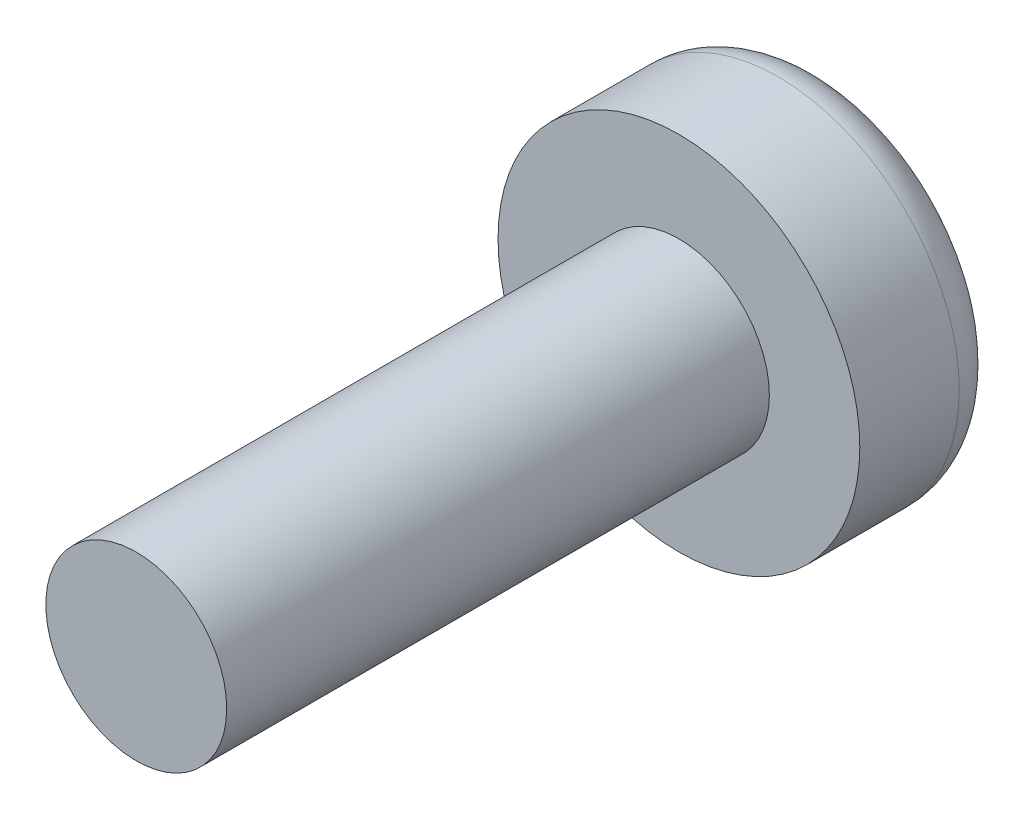
ISO-10303-21;
HEADER;
FILE_DESCRIPTION(('STEP AP214'),'2;1');
FILE_NAME('part.step','',(''),(''),'','','');
FILE_SCHEMA(('AUTOMOTIVE_DESIGN { 1 0 10303 214 1 1 1 1 }'));
ENDSEC;
DATA;
#1=APPLICATION_CONTEXT('core data for automotive mechanical design processes');
#2=APPLICATION_PROTOCOL_DEFINITION('international standard','automotive_design',2000,#1);
#3=PRODUCT_CONTEXT('',#1,'mechanical');
#4=PRODUCT('Part','Part','',(#3));
#5=PRODUCT_RELATED_PRODUCT_CATEGORY('part','',(#4));
#6=PRODUCT_DEFINITION_FORMATION('','',#4);
#7=PRODUCT_DEFINITION_CONTEXT('part definition',#1,'design');
#8=PRODUCT_DEFINITION('design','',#6,#7);
#9=PRODUCT_DEFINITION_SHAPE('','',#8);
#10=(LENGTH_UNIT() NAMED_UNIT(*) SI_UNIT(.MILLI.,.METRE.));
#11=(NAMED_UNIT(*) PLANE_ANGLE_UNIT() SI_UNIT($,.RADIAN.));
#12=(NAMED_UNIT(*) SI_UNIT($,.STERADIAN.) SOLID_ANGLE_UNIT());
#13=UNCERTAINTY_MEASURE_WITH_UNIT(LENGTH_MEASURE(1.E-05),#10,'distance_accuracy_value','');
#14=(GEOMETRIC_REPRESENTATION_CONTEXT(3) GLOBAL_UNCERTAINTY_ASSIGNED_CONTEXT((#13)) GLOBAL_UNIT_ASSIGNED_CONTEXT((#10,
#11,#12)) REPRESENTATION_CONTEXT('',''));
#15=CARTESIAN_POINT('',(0.,0.,0.));
#16=DIRECTION('',(0.,0.,1.));
#17=DIRECTION('',(1.,0.,0.));
#18=AXIS2_PLACEMENT_3D('',#15,#16,#17);
#19=CARTESIAN_POINT('',(0.,0.,0.));
#20=DIRECTION('',(0.,0.,1.));
#21=DIRECTION('',(1.,0.,0.));
#22=AXIS2_PLACEMENT_3D('',#19,#20,#21);
#23=PLANE('',#22);
#24=CARTESIAN_POINT('',(0.,0.,0.));
#25=DIRECTION('',(0.,0.,1.));
#26=DIRECTION('',(1.,0.,0.));
#27=AXIS2_PLACEMENT_3D('',#24,#25,#26);
#28=CIRCLE('',#27,1.8);
#29=CARTESIAN_POINT('',(1.8,0.,0.));
#30=VERTEX_POINT('',#29);
#31=EDGE_CURVE('E11',#30,#30,#28,.F.);
#32=ORIENTED_EDGE('',*,*,#31,.T.);
#33=EDGE_LOOP('',(#32));
#34=FACE_BOUND('',#33,.T.);
#35=DIRECTION('',(0.,-1.,0.));
#36=VECTOR('',#35,1.);
#37=CARTESIAN_POINT('',(-1.224,0.,0.));
#38=LINE('',#37,#36);
#39=CARTESIAN_POINT('',(-1.224,0.258,0.));
#40=VERTEX_POINT('',#39);
#41=CARTESIAN_POINT('',(-1.224,-0.258,0.));
#42=VERTEX_POINT('',#41);
#43=EDGE_CURVE('E214',#40,#42,#38,.T.);
#44=ORIENTED_EDGE('',*,*,#43,.T.);
#45=DIRECTION('',(-1.,0.,0.));
#46=VECTOR('',#45,1.);
#47=CARTESIAN_POINT('',(0.,-0.258,0.));
#48=LINE('',#47,#46);
#49=CARTESIAN_POINT('',(-0.258000000000001,-0.258,0.));
#50=VERTEX_POINT('',#49);
#51=EDGE_CURVE('E186',#50,#42,#48,.T.);
#52=ORIENTED_EDGE('',*,*,#51,.F.);
#53=DIRECTION('',(0.,1.,0.));
#54=VECTOR('',#53,1.);
#55=CARTESIAN_POINT('',(-0.258000000000001,0.,0.));
#56=LINE('',#55,#54);
#57=CARTESIAN_POINT('',(-0.258,-1.224,0.));
#58=VERTEX_POINT('',#57);
#59=EDGE_CURVE('E190',#58,#50,#56,.T.);
#60=ORIENTED_EDGE('',*,*,#59,.F.);
#61=DIRECTION('',(-1.,0.,0.));
#62=VECTOR('',#61,1.);
#63=CARTESIAN_POINT('',(0.,-1.224,0.));
#64=LINE('',#63,#62);
#65=CARTESIAN_POINT('',(0.258000000000001,-1.224,0.));
#66=VERTEX_POINT('',#65);
#67=EDGE_CURVE('E248',#66,#58,#64,.T.);
#68=ORIENTED_EDGE('',*,*,#67,.F.);
#69=DIRECTION('',(0.,1.,0.));
#70=VECTOR('',#69,1.);
#71=CARTESIAN_POINT('',(0.258,0.,0.));
#72=LINE('',#71,#70);
#73=CARTESIAN_POINT('',(0.258,-0.258,0.));
#74=VERTEX_POINT('',#73);
#75=EDGE_CURVE('E244',#66,#74,#72,.T.);
#76=ORIENTED_EDGE('',*,*,#75,.T.);
#77=DIRECTION('',(1.,0.,0.));
#78=VECTOR('',#77,1.);
#79=CARTESIAN_POINT('',(0.,-0.258,0.));
#80=LINE('',#79,#78);
#81=CARTESIAN_POINT('',(1.224,-0.258,0.));
#82=VERTEX_POINT('',#81);
#83=EDGE_CURVE('E240',#74,#82,#80,.T.);
#84=ORIENTED_EDGE('',*,*,#83,.T.);
#85=DIRECTION('',(0.,-1.,0.));
#86=VECTOR('',#85,1.);
#87=CARTESIAN_POINT('',(1.224,0.,0.));
#88=LINE('',#87,#86);
#89=CARTESIAN_POINT('',(1.224,0.258,0.));
#90=VERTEX_POINT('',#89);
#91=EDGE_CURVE('E236',#90,#82,#88,.T.);
#92=ORIENTED_EDGE('',*,*,#91,.F.);
#93=DIRECTION('',(1.,0.,0.));
#94=VECTOR('',#93,1.);
#95=CARTESIAN_POINT('',(0.,0.258,0.));
#96=LINE('',#95,#94);
#97=CARTESIAN_POINT('',(0.258,0.258,0.));
#98=VERTEX_POINT('',#97);
#99=EDGE_CURVE('E232',#98,#90,#96,.T.);
#100=ORIENTED_EDGE('',*,*,#99,.F.);
#101=DIRECTION('',(0.,-1.,0.));
#102=VECTOR('',#101,1.);
#103=CARTESIAN_POINT('',(0.258,0.,0.));
#104=LINE('',#103,#102);
#105=CARTESIAN_POINT('',(0.258,1.224,0.));
#106=VERTEX_POINT('',#105);
#107=EDGE_CURVE('E228',#106,#98,#104,.T.);
#108=ORIENTED_EDGE('',*,*,#107,.F.);
#109=DIRECTION('',(-1.,0.,0.));
#110=VECTOR('',#109,1.);
#111=CARTESIAN_POINT('',(0.,1.224,0.));
#112=LINE('',#111,#110);
#113=CARTESIAN_POINT('',(-0.258,1.224,0.));
#114=VERTEX_POINT('',#113);
#115=EDGE_CURVE('E224',#106,#114,#112,.T.);
#116=ORIENTED_EDGE('',*,*,#115,.T.);
#117=DIRECTION('',(0.,-1.,0.));
#118=VECTOR('',#117,1.);
#119=CARTESIAN_POINT('',(-0.258000000000001,0.,0.));
#120=LINE('',#119,#118);
#121=CARTESIAN_POINT('',(-0.258000000000001,0.258,0.));
#122=VERTEX_POINT('',#121);
#123=EDGE_CURVE('E221',#114,#122,#120,.T.);
#124=ORIENTED_EDGE('',*,*,#123,.T.);
#125=DIRECTION('',(-1.,0.,0.));
#126=VECTOR('',#125,1.);
#127=CARTESIAN_POINT('',(0.,0.258,0.));
#128=LINE('',#127,#126);
#129=EDGE_CURVE('E174',#122,#40,#128,.T.);
#130=ORIENTED_EDGE('',*,*,#129,.T.);
#131=EDGE_LOOP('',(#44,#52,#60,#68,#76,#84,#92,#100,#108,#116,#124,#130));
#132=FACE_BOUND('',#131,.T.);
#133=ADVANCED_FACE('F41',(#34,#132),#23,.F.);
#134=CARTESIAN_POINT('',(0.,0.,1.92));
#135=DIRECTION('',(0.,0.,-1.));
#136=DIRECTION('',(-1.,0.,0.));
#137=AXIS2_PLACEMENT_3D('',#134,#135,#136);
#138=CYLINDRICAL_SURFACE('',#137,2.4);
#139=CARTESIAN_POINT('',(0.,0.,0.6));
#140=DIRECTION('',(0.,0.,1.));
#141=DIRECTION('',(1.,0.,0.));
#142=AXIS2_PLACEMENT_3D('',#139,#140,#141);
#143=CIRCLE('',#142,2.4);
#144=CARTESIAN_POINT('',(2.4,0.,0.6));
#145=VERTEX_POINT('',#144);
#146=EDGE_CURVE('E50',#145,#145,#143,.T.);
#147=ORIENTED_EDGE('',*,*,#146,.T.);
#148=EDGE_LOOP('',(#147));
#149=FACE_BOUND('',#148,.T.);
#150=CARTESIAN_POINT('',(0.,0.,1.92));
#151=DIRECTION('',(0.,0.,1.));
#152=DIRECTION('',(1.,0.,0.));
#153=AXIS2_PLACEMENT_3D('',#150,#151,#152);
#154=CIRCLE('',#153,2.4);
#155=CARTESIAN_POINT('',(2.4,0.,1.92));
#156=VERTEX_POINT('',#155);
#157=EDGE_CURVE('E258',#156,#156,#154,.T.);
#158=ORIENTED_EDGE('',*,*,#157,.F.);
#159=EDGE_LOOP('',(#158));
#160=FACE_BOUND('',#159,.T.);
#161=ADVANCED_FACE('F351',(#149,#160),#138,.T.);
#162=CARTESIAN_POINT('',(0.,0.,1.92));
#163=DIRECTION('',(0.,0.,1.));
#164=DIRECTION('',(1.,0.,0.));
#165=AXIS2_PLACEMENT_3D('',#162,#163,#164);
#166=PLANE('',#165);
#167=CARTESIAN_POINT('',(0.,0.,1.92));
#168=DIRECTION('',(0.,0.,1.));
#169=DIRECTION('',(1.,0.,0.));
#170=AXIS2_PLACEMENT_3D('',#167,#168,#169);
#171=CIRCLE('',#170,1.2);
#172=CARTESIAN_POINT('',(1.2,0.,1.92));
#173=VERTEX_POINT('',#172);
#174=EDGE_CURVE('E193',#173,#173,#171,.T.);
#175=ORIENTED_EDGE('',*,*,#174,.F.);
#176=EDGE_LOOP('',(#175));
#177=FACE_BOUND('',#176,.T.);
#178=ORIENTED_EDGE('',*,*,#157,.T.);
#179=EDGE_LOOP('',(#178));
#180=FACE_BOUND('',#179,.T.);
#181=ADVANCED_FACE('F347',(#177,#180),#166,.T.);
#182=CARTESIAN_POINT('',(-1.224,0.,0.72));
#183=DIRECTION('',(1.,0.,0.));
#184=DIRECTION('',(0.,0.,-1.));
#185=AXIS2_PLACEMENT_3D('',#182,#183,#184);
#186=PLANE('',#185);
#187=DIRECTION('',(0.,0.,-1.));
#188=VECTOR('',#187,1.);
#189=CARTESIAN_POINT('',(-1.224,0.258,0.72));
#190=LINE('',#189,#188);
#191=CARTESIAN_POINT('',(-1.224,0.258,0.36));
#192=VERTEX_POINT('',#191);
#193=EDGE_CURVE('E178',#192,#40,#190,.T.);
#194=ORIENTED_EDGE('',*,*,#193,.F.);
#195=DIRECTION('',(0.,-1.,0.));
#196=VECTOR('',#195,1.);
#197=CARTESIAN_POINT('',(-1.224,-0.258,0.36));
#198=LINE('',#197,#196);
#199=CARTESIAN_POINT('',(-1.224,-0.258,0.36));
#200=VERTEX_POINT('',#199);
#201=EDGE_CURVE('E312',#192,#200,#198,.T.);
#202=ORIENTED_EDGE('',*,*,#201,.T.);
#203=DIRECTION('',(0.,0.,-1.));
#204=VECTOR('',#203,1.);
#205=CARTESIAN_POINT('',(-1.224,-0.258,0.72));
#206=LINE('',#205,#204);
#207=EDGE_CURVE('E255',#200,#42,#206,.T.);
#208=ORIENTED_EDGE('',*,*,#207,.T.);
#209=ORIENTED_EDGE('',*,*,#43,.F.);
#210=EDGE_LOOP('',(#194,#202,#208,#209));
#211=FACE_BOUND('',#210,.T.);
#212=ADVANCED_FACE('F350',(#211),#186,.T.);
#213=CARTESIAN_POINT('',(0.,-0.258,0.72));
#214=DIRECTION('',(0.,-1.,0.));
#215=DIRECTION('',(1.,0.,0.));
#216=AXIS2_PLACEMENT_3D('',#213,#214,#215);
#217=PLANE('',#216);
#218=ORIENTED_EDGE('',*,*,#207,.F.);
#219=CARTESIAN_POINT('',(-0.864,-0.258,0.36));
#220=DIRECTION('',(0.,-1.,0.));
#221=DIRECTION('',(1.,0.,0.));
#222=AXIS2_PLACEMENT_3D('',#219,#220,#221);
#223=CIRCLE('',#222,0.36);
#224=CARTESIAN_POINT('',(-0.864,-0.258,0.72));
#225=VERTEX_POINT('',#224);
#226=EDGE_CURVE('E316',#200,#225,#223,.F.);
#227=ORIENTED_EDGE('',*,*,#226,.T.);
#228=DIRECTION('',(-1.,0.,0.));
#229=VECTOR('',#228,1.);
#230=CARTESIAN_POINT('',(0.,-0.258,0.72));
#231=LINE('',#230,#229);
#232=CARTESIAN_POINT('',(-0.258000000000001,-0.258,0.72));
#233=VERTEX_POINT('',#232);
#234=EDGE_CURVE('E211',#233,#225,#231,.T.);
#235=ORIENTED_EDGE('',*,*,#234,.F.);
#236=DIRECTION('',(0.,0.,-1.));
#237=VECTOR('',#236,1.);
#238=CARTESIAN_POINT('',(-0.258000000000001,-0.258,0.72));
#239=LINE('',#238,#237);
#240=EDGE_CURVE('E259',#233,#50,#239,.T.);
#241=ORIENTED_EDGE('',*,*,#240,.T.);
#242=ORIENTED_EDGE('',*,*,#51,.T.);
#243=EDGE_LOOP('',(#218,#227,#235,#241,#242));
#244=FACE_BOUND('',#243,.T.);
#245=ADVANCED_FACE('F427',(#244),#217,.F.);
#246=CARTESIAN_POINT('',(-0.258000000000001,0.,0.72));
#247=DIRECTION('',(-1.,0.,0.));
#248=DIRECTION('',(0.,-1.,0.));
#249=AXIS2_PLACEMENT_3D('',#246,#247,#248);
#250=PLANE('',#249);
#251=DIRECTION('',(0.,1.,0.));
#252=VECTOR('',#251,1.);
#253=CARTESIAN_POINT('',(-0.258000000000001,0.,0.72));
#254=LINE('',#253,#252);
#255=CARTESIAN_POINT('',(-0.258,-0.864,0.72));
#256=VERTEX_POINT('',#255);
#257=EDGE_CURVE('E208',#256,#233,#254,.T.);
#258=ORIENTED_EDGE('',*,*,#257,.F.);
#259=CARTESIAN_POINT('',(-0.258,-0.864,0.36));
#260=DIRECTION('',(-1.,0.,0.));
#261=DIRECTION('',(0.,-1.,0.));
#262=AXIS2_PLACEMENT_3D('',#259,#260,#261);
#263=CIRCLE('',#262,0.36);
#264=CARTESIAN_POINT('',(-0.258,-1.224,0.36));
#265=VERTEX_POINT('',#264);
#266=EDGE_CURVE('E322',#256,#265,#263,.F.);
#267=ORIENTED_EDGE('',*,*,#266,.T.);
#268=DIRECTION('',(0.,0.,-1.));
#269=VECTOR('',#268,1.);
#270=CARTESIAN_POINT('',(-0.258,-1.224,0.72));
#271=LINE('',#270,#269);
#272=EDGE_CURVE('E262',#265,#58,#271,.T.);
#273=ORIENTED_EDGE('',*,*,#272,.T.);
#274=ORIENTED_EDGE('',*,*,#59,.T.);
#275=ORIENTED_EDGE('',*,*,#240,.F.);
#276=EDGE_LOOP('',(#258,#267,#273,#274,#275));
#277=FACE_BOUND('',#276,.T.);
#278=ADVANCED_FACE('F417',(#277),#250,.F.);
#279=CARTESIAN_POINT('',(0.,-1.224,0.72));
#280=DIRECTION('',(0.,-1.,0.));
#281=DIRECTION('',(0.,0.,-1.));
#282=AXIS2_PLACEMENT_3D('',#279,#280,#281);
#283=PLANE('',#282);
#284=ORIENTED_EDGE('',*,*,#272,.F.);
#285=DIRECTION('',(-1.,0.,0.));
#286=VECTOR('',#285,1.);
#287=CARTESIAN_POINT('',(0.,-1.224,0.36));
#288=LINE('',#287,#286);
#289=CARTESIAN_POINT('',(0.258000000000001,-1.224,0.36));
#290=VERTEX_POINT('',#289);
#291=EDGE_CURVE('E325',#265,#290,#288,.F.);
#292=ORIENTED_EDGE('',*,*,#291,.T.);
#293=DIRECTION('',(0.,0.,-1.));
#294=VECTOR('',#293,1.);
#295=CARTESIAN_POINT('',(0.258000000000001,-1.224,0.72));
#296=LINE('',#295,#294);
#297=EDGE_CURVE('E265',#290,#66,#296,.T.);
#298=ORIENTED_EDGE('',*,*,#297,.T.);
#299=ORIENTED_EDGE('',*,*,#67,.T.);
#300=EDGE_LOOP('',(#284,#292,#298,#299));
#301=FACE_BOUND('',#300,.T.);
#302=ADVANCED_FACE('F420',(#301),#283,.F.);
#303=CARTESIAN_POINT('',(0.258,0.,0.72));
#304=DIRECTION('',(-1.,0.,0.));
#305=DIRECTION('',(0.,-1.,0.));
#306=AXIS2_PLACEMENT_3D('',#303,#304,#305);
#307=PLANE('',#306);
#308=ORIENTED_EDGE('',*,*,#297,.F.);
#309=CARTESIAN_POINT('',(0.258,-0.864,0.36));
#310=DIRECTION('',(-1.,0.,0.));
#311=DIRECTION('',(0.,-1.,0.));
#312=AXIS2_PLACEMENT_3D('',#309,#310,#311);
#313=CIRCLE('',#312,0.36);
#314=CARTESIAN_POINT('',(0.258,-0.864,0.72));
#315=VERTEX_POINT('',#314);
#316=EDGE_CURVE('E328',#290,#315,#313,.T.);
#317=ORIENTED_EDGE('',*,*,#316,.T.);
#318=DIRECTION('',(0.,1.,0.));
#319=VECTOR('',#318,1.);
#320=CARTESIAN_POINT('',(0.258,0.,0.72));
#321=LINE('',#320,#319);
#322=CARTESIAN_POINT('',(0.258,-0.258,0.72));
#323=VERTEX_POINT('',#322);
#324=EDGE_CURVE('E205',#315,#323,#321,.T.);
#325=ORIENTED_EDGE('',*,*,#324,.T.);
#326=DIRECTION('',(0.,0.,-1.));
#327=VECTOR('',#326,1.);
#328=CARTESIAN_POINT('',(0.258,-0.258,0.72));
#329=LINE('',#328,#327);
#330=EDGE_CURVE('E268',#323,#74,#329,.T.);
#331=ORIENTED_EDGE('',*,*,#330,.T.);
#332=ORIENTED_EDGE('',*,*,#75,.F.);
#333=EDGE_LOOP('',(#308,#317,#325,#331,#332));
#334=FACE_BOUND('',#333,.T.);
#335=ADVANCED_FACE('F454',(#334),#307,.T.);
#336=CARTESIAN_POINT('',(0.,-0.258,0.72));
#337=DIRECTION('',(0.,1.,0.));
#338=DIRECTION('',(-1.,0.,0.));
#339=AXIS2_PLACEMENT_3D('',#336,#337,#338);
#340=PLANE('',#339);
#341=DIRECTION('',(1.,0.,0.));
#342=VECTOR('',#341,1.);
#343=CARTESIAN_POINT('',(0.,-0.258,0.72));
#344=LINE('',#343,#342);
#345=CARTESIAN_POINT('',(0.864,-0.258,0.72));
#346=VERTEX_POINT('',#345);
#347=EDGE_CURVE('E201',#323,#346,#344,.T.);
#348=ORIENTED_EDGE('',*,*,#347,.T.);
#349=CARTESIAN_POINT('',(0.864,-0.258,0.36));
#350=DIRECTION('',(0.,1.,0.));
#351=DIRECTION('',(-1.,0.,0.));
#352=AXIS2_PLACEMENT_3D('',#349,#350,#351);
#353=CIRCLE('',#352,0.36);
#354=CARTESIAN_POINT('',(1.224,-0.258,0.36));
#355=VERTEX_POINT('',#354);
#356=EDGE_CURVE('E303',#346,#355,#353,.T.);
#357=ORIENTED_EDGE('',*,*,#356,.T.);
#358=DIRECTION('',(0.,0.,-1.));
#359=VECTOR('',#358,1.);
#360=CARTESIAN_POINT('',(1.224,-0.258,0.72));
#361=LINE('',#360,#359);
#362=EDGE_CURVE('E271',#355,#82,#361,.T.);
#363=ORIENTED_EDGE('',*,*,#362,.T.);
#364=ORIENTED_EDGE('',*,*,#83,.F.);
#365=ORIENTED_EDGE('',*,*,#330,.F.);
#366=EDGE_LOOP('',(#348,#357,#363,#364,#365));
#367=FACE_BOUND('',#366,.T.);
#368=ADVANCED_FACE('F402',(#367),#340,.T.);
#369=CARTESIAN_POINT('',(1.224,0.,0.72));
#370=DIRECTION('',(1.,0.,0.));
#371=DIRECTION('',(0.,0.,-1.));
#372=AXIS2_PLACEMENT_3D('',#369,#370,#371);
#373=PLANE('',#372);
#374=ORIENTED_EDGE('',*,*,#362,.F.);
#375=DIRECTION('',(0.,-1.,0.));
#376=VECTOR('',#375,1.);
#377=CARTESIAN_POINT('',(1.224,0.,0.36));
#378=LINE('',#377,#376);
#379=CARTESIAN_POINT('',(1.224,0.258,0.36));
#380=VERTEX_POINT('',#379);
#381=EDGE_CURVE('E306',#355,#380,#378,.F.);
#382=ORIENTED_EDGE('',*,*,#381,.T.);
#383=DIRECTION('',(0.,0.,-1.));
#384=VECTOR('',#383,1.);
#385=CARTESIAN_POINT('',(1.224,0.258,0.72));
#386=LINE('',#385,#384);
#387=EDGE_CURVE('E274',#380,#90,#386,.T.);
#388=ORIENTED_EDGE('',*,*,#387,.T.);
#389=ORIENTED_EDGE('',*,*,#91,.T.);
#390=EDGE_LOOP('',(#374,#382,#388,#389));
#391=FACE_BOUND('',#390,.T.);
#392=ADVANCED_FACE('F406',(#391),#373,.F.);
#393=CARTESIAN_POINT('',(0.,0.258,0.72));
#394=DIRECTION('',(0.,1.,0.));
#395=DIRECTION('',(-1.,0.,0.));
#396=AXIS2_PLACEMENT_3D('',#393,#394,#395);
#397=PLANE('',#396);
#398=ORIENTED_EDGE('',*,*,#387,.F.);
#399=CARTESIAN_POINT('',(0.864,0.258,0.36));
#400=DIRECTION('',(0.,1.,0.));
#401=DIRECTION('',(-1.,0.,0.));
#402=AXIS2_PLACEMENT_3D('',#399,#400,#401);
#403=CIRCLE('',#402,0.36);
#404=CARTESIAN_POINT('',(0.864,0.258,0.72));
#405=VERTEX_POINT('',#404);
#406=EDGE_CURVE('E309',#380,#405,#403,.F.);
#407=ORIENTED_EDGE('',*,*,#406,.T.);
#408=DIRECTION('',(1.,0.,0.));
#409=VECTOR('',#408,1.);
#410=CARTESIAN_POINT('',(0.,0.258,0.72));
#411=LINE('',#410,#409);
#412=CARTESIAN_POINT('',(0.258,0.258,0.72));
#413=VERTEX_POINT('',#412);
#414=EDGE_CURVE('E198',#413,#405,#411,.T.);
#415=ORIENTED_EDGE('',*,*,#414,.F.);
#416=DIRECTION('',(0.,0.,-1.));
#417=VECTOR('',#416,1.);
#418=CARTESIAN_POINT('',(0.258,0.258,0.72));
#419=LINE('',#418,#417);
#420=EDGE_CURVE('E277',#413,#98,#419,.T.);
#421=ORIENTED_EDGE('',*,*,#420,.T.);
#422=ORIENTED_EDGE('',*,*,#99,.T.);
#423=EDGE_LOOP('',(#398,#407,#415,#421,#422));
#424=FACE_BOUND('',#423,.T.);
#425=ADVANCED_FACE('F395',(#424),#397,.F.);
#426=CARTESIAN_POINT('',(0.258,0.,0.72));
#427=DIRECTION('',(1.,0.,0.));
#428=DIRECTION('',(0.,1.,0.));
#429=AXIS2_PLACEMENT_3D('',#426,#427,#428);
#430=PLANE('',#429);
#431=DIRECTION('',(0.,-1.,0.));
#432=VECTOR('',#431,1.);
#433=CARTESIAN_POINT('',(0.258,0.,0.72));
#434=LINE('',#433,#432);
#435=CARTESIAN_POINT('',(0.258,0.864,0.72));
#436=VERTEX_POINT('',#435);
#437=EDGE_CURVE('E166',#436,#413,#434,.T.);
#438=ORIENTED_EDGE('',*,*,#437,.F.);
#439=CARTESIAN_POINT('',(0.258,0.864,0.36));
#440=DIRECTION('',(1.,0.,0.));
#441=DIRECTION('',(0.,1.,0.));
#442=AXIS2_PLACEMENT_3D('',#439,#440,#441);
#443=CIRCLE('',#442,0.36);
#444=CARTESIAN_POINT('',(0.258,1.224,0.36));
#445=VERTEX_POINT('',#444);
#446=EDGE_CURVE('E65',#436,#445,#443,.F.);
#447=ORIENTED_EDGE('',*,*,#446,.T.);
#448=DIRECTION('',(0.,0.,-1.));
#449=VECTOR('',#448,1.);
#450=CARTESIAN_POINT('',(0.258,1.224,0.72));
#451=LINE('',#450,#449);
#452=EDGE_CURVE('E280',#445,#106,#451,.T.);
#453=ORIENTED_EDGE('',*,*,#452,.T.);
#454=ORIENTED_EDGE('',*,*,#107,.T.);
#455=ORIENTED_EDGE('',*,*,#420,.F.);
#456=EDGE_LOOP('',(#438,#447,#453,#454,#455));
#457=FACE_BOUND('',#456,.T.);
#458=ADVANCED_FACE('F391',(#457),#430,.F.);
#459=CARTESIAN_POINT('',(0.,1.224,0.72));
#460=DIRECTION('',(0.,-1.,0.));
#461=DIRECTION('',(1.,0.,0.));
#462=AXIS2_PLACEMENT_3D('',#459,#460,#461);
#463=PLANE('',#462);
#464=ORIENTED_EDGE('',*,*,#452,.F.);
#465=DIRECTION('',(-1.,0.,0.));
#466=VECTOR('',#465,1.);
#467=CARTESIAN_POINT('',(-0.258,1.224,0.36));
#468=LINE('',#467,#466);
#469=CARTESIAN_POINT('',(-0.258,1.224,0.36));
#470=VERTEX_POINT('',#469);
#471=EDGE_CURVE('E331',#445,#470,#468,.T.);
#472=ORIENTED_EDGE('',*,*,#471,.T.);
#473=DIRECTION('',(0.,0.,-1.));
#474=VECTOR('',#473,1.);
#475=CARTESIAN_POINT('',(-0.258,1.224,0.72));
#476=LINE('',#475,#474);
#477=EDGE_CURVE('E177',#470,#114,#476,.T.);
#478=ORIENTED_EDGE('',*,*,#477,.T.);
#479=ORIENTED_EDGE('',*,*,#115,.F.);
#480=EDGE_LOOP('',(#464,#472,#478,#479));
#481=FACE_BOUND('',#480,.T.);
#482=ADVANCED_FACE('F384',(#481),#463,.T.);
#483=CARTESIAN_POINT('',(-0.258000000000001,0.,0.72));
#484=DIRECTION('',(1.,0.,0.));
#485=DIRECTION('',(0.,1.,0.));
#486=AXIS2_PLACEMENT_3D('',#483,#484,#485);
#487=PLANE('',#486);
#488=ORIENTED_EDGE('',*,*,#477,.F.);
#489=CARTESIAN_POINT('',(-0.258,0.864000000000001,0.36));
#490=DIRECTION('',(1.,0.,0.));
#491=DIRECTION('',(0.,1.,0.));
#492=AXIS2_PLACEMENT_3D('',#489,#490,#491);
#493=CIRCLE('',#492,0.36);
#494=CARTESIAN_POINT('',(-0.258,0.864000000000001,0.72));
#495=VERTEX_POINT('',#494);
#496=EDGE_CURVE('E57',#470,#495,#493,.T.);
#497=ORIENTED_EDGE('',*,*,#496,.T.);
#498=DIRECTION('',(0.,-1.,0.));
#499=VECTOR('',#498,1.);
#500=CARTESIAN_POINT('',(-0.258000000000001,0.,0.72));
#501=LINE('',#500,#499);
#502=CARTESIAN_POINT('',(-0.258000000000001,0.258,0.72));
#503=VERTEX_POINT('',#502);
#504=EDGE_CURVE('E156',#495,#503,#501,.T.);
#505=ORIENTED_EDGE('',*,*,#504,.T.);
#506=DIRECTION('',(0.,0.,-1.));
#507=VECTOR('',#506,1.);
#508=CARTESIAN_POINT('',(-0.258000000000001,0.258,0.72));
#509=LINE('',#508,#507);
#510=EDGE_CURVE('E161',#503,#122,#509,.T.);
#511=ORIENTED_EDGE('',*,*,#510,.T.);
#512=ORIENTED_EDGE('',*,*,#123,.F.);
#513=EDGE_LOOP('',(#488,#497,#505,#511,#512));
#514=FACE_BOUND('',#513,.T.);
#515=ADVANCED_FACE('F159',(#514),#487,.T.);
#516=CARTESIAN_POINT('',(0.,0.258,0.72));
#517=DIRECTION('',(0.,-1.,0.));
#518=DIRECTION('',(1.,0.,0.));
#519=AXIS2_PLACEMENT_3D('',#516,#517,#518);
#520=PLANE('',#519);
#521=DIRECTION('',(-1.,0.,0.));
#522=VECTOR('',#521,1.);
#523=CARTESIAN_POINT('',(0.,0.258,0.72));
#524=LINE('',#523,#522);
#525=CARTESIAN_POINT('',(-0.864,0.258,0.72));
#526=VERTEX_POINT('',#525);
#527=EDGE_CURVE('E167',#503,#526,#524,.T.);
#528=ORIENTED_EDGE('',*,*,#527,.T.);
#529=CARTESIAN_POINT('',(-0.864,0.258,0.36));
#530=DIRECTION('',(0.,-1.,0.));
#531=DIRECTION('',(1.,0.,0.));
#532=AXIS2_PLACEMENT_3D('',#529,#530,#531);
#533=CIRCLE('',#532,0.36);
#534=EDGE_CURVE('E319',#526,#192,#533,.T.);
#535=ORIENTED_EDGE('',*,*,#534,.T.);
#536=ORIENTED_EDGE('',*,*,#193,.T.);
#537=ORIENTED_EDGE('',*,*,#129,.F.);
#538=ORIENTED_EDGE('',*,*,#510,.F.);
#539=EDGE_LOOP('',(#528,#535,#536,#537,#538));
#540=FACE_BOUND('',#539,.T.);
#541=ADVANCED_FACE('F171',(#540),#520,.T.);
#542=CARTESIAN_POINT('',(0.,0.,0.72));
#543=DIRECTION('',(0.,0.,-1.));
#544=DIRECTION('',(-1.,0.,0.));
#545=AXIS2_PLACEMENT_3D('',#542,#543,#544);
#546=PLANE('',#545);
#547=ORIENTED_EDGE('',*,*,#414,.T.);
#548=DIRECTION('',(0.,-1.,0.));
#549=VECTOR('',#548,1.);
#550=CARTESIAN_POINT('',(0.864,0.,0.72));
#551=LINE('',#550,#549);
#552=EDGE_CURVE('E299',#405,#346,#551,.T.);
#553=ORIENTED_EDGE('',*,*,#552,.T.);
#554=ORIENTED_EDGE('',*,*,#347,.F.);
#555=ORIENTED_EDGE('',*,*,#324,.F.);
#556=DIRECTION('',(-1.,0.,0.));
#557=VECTOR('',#556,1.);
#558=CARTESIAN_POINT('',(0.,-0.864,0.72));
#559=LINE('',#558,#557);
#560=EDGE_CURVE('E293',#315,#256,#559,.T.);
#561=ORIENTED_EDGE('',*,*,#560,.T.);
#562=ORIENTED_EDGE('',*,*,#257,.T.);
#563=ORIENTED_EDGE('',*,*,#234,.T.);
#564=DIRECTION('',(0.,-1.,0.));
#565=VECTOR('',#564,1.);
#566=CARTESIAN_POINT('',(-0.864,0.258,0.72));
#567=LINE('',#566,#565);
#568=EDGE_CURVE('E184',#225,#526,#567,.F.);
#569=ORIENTED_EDGE('',*,*,#568,.T.);
#570=ORIENTED_EDGE('',*,*,#527,.F.);
#571=ORIENTED_EDGE('',*,*,#504,.F.);
#572=DIRECTION('',(-1.,0.,0.));
#573=VECTOR('',#572,1.);
#574=CARTESIAN_POINT('',(0.258,0.864,0.72));
#575=LINE('',#574,#573);
#576=EDGE_CURVE('E290',#495,#436,#575,.F.);
#577=ORIENTED_EDGE('',*,*,#576,.T.);
#578=ORIENTED_EDGE('',*,*,#437,.T.);
#579=EDGE_LOOP('',(#547,#553,#554,#555,#561,#562,#563,#569,#570,#571,#577,#578));
#580=FACE_BOUND('',#579,.T.);
#581=ADVANCED_FACE('F181',(#580),#546,.T.);
#582=CARTESIAN_POINT('',(0.864,0.,0.36));
#583=DIRECTION('',(0.,-1.,0.));
#584=DIRECTION('',(0.,0.,-1.));
#585=AXIS2_PLACEMENT_3D('',#582,#583,#584);
#586=CYLINDRICAL_SURFACE('',#585,0.36);
#587=ORIENTED_EDGE('',*,*,#406,.F.);
#588=ORIENTED_EDGE('',*,*,#381,.F.);
#589=ORIENTED_EDGE('',*,*,#356,.F.);
#590=ORIENTED_EDGE('',*,*,#552,.F.);
#591=EDGE_LOOP('',(#587,#588,#589,#590));
#592=FACE_BOUND('',#591,.T.);
#593=ADVANCED_FACE('F364',(#592),#586,.F.);
#594=CARTESIAN_POINT('',(-0.864,0.,0.36));
#595=DIRECTION('',(0.,1.,0.));
#596=DIRECTION('',(0.,0.,1.));
#597=AXIS2_PLACEMENT_3D('',#594,#595,#596);
#598=CYLINDRICAL_SURFACE('',#597,0.36);
#599=ORIENTED_EDGE('',*,*,#534,.F.);
#600=ORIENTED_EDGE('',*,*,#568,.F.);
#601=ORIENTED_EDGE('',*,*,#226,.F.);
#602=ORIENTED_EDGE('',*,*,#201,.F.);
#603=EDGE_LOOP('',(#599,#600,#601,#602));
#604=FACE_BOUND('',#603,.T.);
#605=ADVANCED_FACE('F367',(#604),#598,.F.);
#606=CARTESIAN_POINT('',(0.,-0.864,0.36));
#607=DIRECTION('',(-1.,0.,0.));
#608=DIRECTION('',(0.,0.,1.));
#609=AXIS2_PLACEMENT_3D('',#606,#607,#608);
#610=CYLINDRICAL_SURFACE('',#609,0.36);
#611=ORIENTED_EDGE('',*,*,#316,.F.);
#612=ORIENTED_EDGE('',*,*,#291,.F.);
#613=ORIENTED_EDGE('',*,*,#266,.F.);
#614=ORIENTED_EDGE('',*,*,#560,.F.);
#615=EDGE_LOOP('',(#611,#612,#613,#614));
#616=FACE_BOUND('',#615,.T.);
#617=ADVANCED_FACE('F371',(#616),#610,.F.);
#618=CARTESIAN_POINT('',(0.,0.864,0.36));
#619=DIRECTION('',(1.,0.,0.));
#620=DIRECTION('',(0.,1.,0.));
#621=AXIS2_PLACEMENT_3D('',#618,#619,#620);
#622=CYLINDRICAL_SURFACE('',#621,0.36);
#623=ORIENTED_EDGE('',*,*,#446,.F.);
#624=ORIENTED_EDGE('',*,*,#576,.F.);
#625=ORIENTED_EDGE('',*,*,#496,.F.);
#626=ORIENTED_EDGE('',*,*,#471,.F.);
#627=EDGE_LOOP('',(#623,#624,#625,#626));
#628=FACE_BOUND('',#627,.T.);
#629=ADVANCED_FACE('F374',(#628),#622,.F.);
#630=CARTESIAN_POINT('',(0.,0.,9.12));
#631=DIRECTION('',(0.,0.,-1.));
#632=DIRECTION('',(-1.,0.,0.));
#633=AXIS2_PLACEMENT_3D('',#630,#631,#632);
#634=CYLINDRICAL_SURFACE('',#633,1.2);
#635=CARTESIAN_POINT('',(0.,0.,9.12));
#636=DIRECTION('',(0.,0.,1.));
#637=DIRECTION('',(1.,0.,0.));
#638=AXIS2_PLACEMENT_3D('',#635,#636,#637);
#639=CIRCLE('',#638,1.2);
#640=CARTESIAN_POINT('',(1.2,0.,9.12));
#641=VERTEX_POINT('',#640);
#642=EDGE_CURVE('E218',#641,#641,#639,.T.);
#643=ORIENTED_EDGE('',*,*,#642,.F.);
#644=EDGE_LOOP('',(#643));
#645=FACE_BOUND('',#644,.T.);
#646=ORIENTED_EDGE('',*,*,#174,.T.);
#647=EDGE_LOOP('',(#646));
#648=FACE_BOUND('',#647,.T.);
#649=ADVANCED_FACE('F345',(#645,#648),#634,.T.);
#650=CARTESIAN_POINT('',(0.,0.,9.12));
#651=DIRECTION('',(0.,0.,1.));
#652=DIRECTION('',(1.,0.,0.));
#653=AXIS2_PLACEMENT_3D('',#650,#651,#652);
#654=PLANE('',#653);
#655=ORIENTED_EDGE('',*,*,#642,.T.);
#656=EDGE_LOOP('',(#655));
#657=FACE_BOUND('',#656,.T.);
#658=ADVANCED_FACE('F380',(#657),#654,.T.);
#659=CARTESIAN_POINT('',(0.,0.,0.6));
#660=DIRECTION('',(0.,0.,1.));
#661=DIRECTION('',(1.,0.,0.));
#662=AXIS2_PLACEMENT_3D('',#659,#660,#661);
#663=TOROIDAL_SURFACE('',#662,1.8,0.6);
#664=ORIENTED_EDGE('',*,*,#31,.F.);
#665=EDGE_LOOP('',(#664));
#666=FACE_BOUND('',#665,.T.);
#667=ORIENTED_EDGE('',*,*,#146,.F.);
#668=EDGE_LOOP('',(#667));
#669=FACE_BOUND('',#668,.T.);
#670=ADVANCED_FACE('F43',(#666,#669),#663,.T.);
#671=CLOSED_SHELL('',(#133,#161,#181,#212,#245,#278,#302,#335,#368,#392,#425,#458,#482,#515,
#541,#581,#593,#605,#617,#629,#649,#658,#670));
#672=MANIFOLD_SOLID_BREP('B2',#671);
#673=ADVANCED_BREP_SHAPE_REPRESENTATION('',(#18,#672),#14);
#674=SHAPE_DEFINITION_REPRESENTATION(#9,#673);
ENDSEC;
END-ISO-10303-21;
